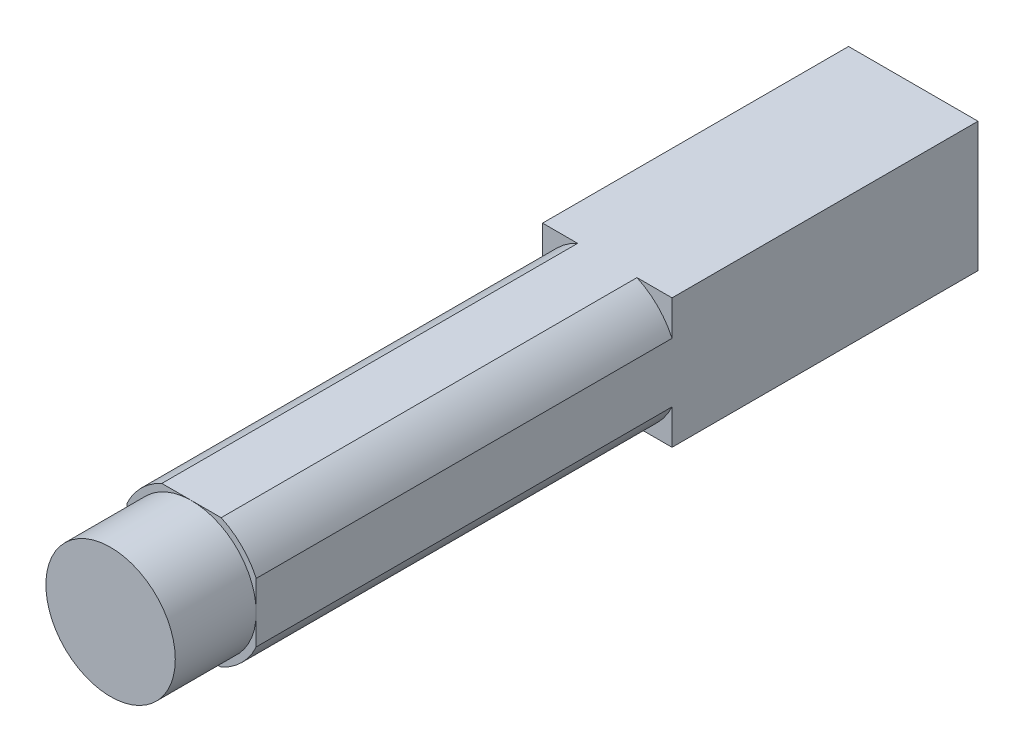
ISO-10303-21;
HEADER;
FILE_DESCRIPTION(('STEP AP214'),'2;1');
FILE_NAME('part.step','',(''),(''),'','','');
FILE_SCHEMA(('AUTOMOTIVE_DESIGN { 1 0 10303 214 1 1 1 1 }'));
ENDSEC;
DATA;
#1=APPLICATION_CONTEXT('core data for automotive mechanical design processes');
#2=APPLICATION_PROTOCOL_DEFINITION('international standard','automotive_design',2000,#1);
#3=PRODUCT_CONTEXT('',#1,'mechanical');
#4=PRODUCT('Part','Part','',(#3));
#5=PRODUCT_RELATED_PRODUCT_CATEGORY('part','',(#4));
#6=PRODUCT_DEFINITION_FORMATION('','',#4);
#7=PRODUCT_DEFINITION_CONTEXT('part definition',#1,'design');
#8=PRODUCT_DEFINITION('design','',#6,#7);
#9=PRODUCT_DEFINITION_SHAPE('','',#8);
#10=(LENGTH_UNIT() NAMED_UNIT(*) SI_UNIT(.MILLI.,.METRE.));
#11=(NAMED_UNIT(*) PLANE_ANGLE_UNIT() SI_UNIT($,.RADIAN.));
#12=(NAMED_UNIT(*) SI_UNIT($,.STERADIAN.) SOLID_ANGLE_UNIT());
#13=UNCERTAINTY_MEASURE_WITH_UNIT(LENGTH_MEASURE(1.E-05),#10,'distance_accuracy_value','');
#14=(GEOMETRIC_REPRESENTATION_CONTEXT(3) GLOBAL_UNCERTAINTY_ASSIGNED_CONTEXT((#13)) GLOBAL_UNIT_ASSIGNED_CONTEXT((#10,
#11,#12)) REPRESENTATION_CONTEXT('',''));
#15=CARTESIAN_POINT('',(0.,0.,0.));
#16=DIRECTION('',(0.,0.,1.));
#17=DIRECTION('',(1.,0.,0.));
#18=AXIS2_PLACEMENT_3D('',#15,#16,#17);
#19=CARTESIAN_POINT('',(3.175,3.175,39.37));
#20=DIRECTION('',(-1.,0.,0.));
#21=DIRECTION('',(0.,-1.,0.));
#22=AXIS2_PLACEMENT_3D('',#19,#20,#21);
#23=PLANE('',#22);
#24=DIRECTION('',(0.,1.,0.));
#25=VECTOR('',#24,1.);
#26=CARTESIAN_POINT('',(3.175,3.175,15.006574));
#27=LINE('',#26,#25);
#28=CARTESIAN_POINT('',(3.175,-3.175,15.006574));
#29=VERTEX_POINT('',#28);
#30=CARTESIAN_POINT('',(3.175,-1.45496778314848,15.006574));
#31=VERTEX_POINT('',#30);
#32=EDGE_CURVE('E153',#29,#31,#27,.T.);
#33=ORIENTED_EDGE('',*,*,#32,.F.);
#34=DIRECTION('',(0.,0.,-1.));
#35=VECTOR('',#34,1.);
#36=CARTESIAN_POINT('',(3.175,-3.175,39.37));
#37=LINE('',#36,#35);
#38=CARTESIAN_POINT('',(3.175,-3.175,0.));
#39=VERTEX_POINT('',#38);
#40=EDGE_CURVE('E223',#29,#39,#37,.T.);
#41=ORIENTED_EDGE('',*,*,#40,.T.);
#42=DIRECTION('',(0.,1.,0.));
#43=VECTOR('',#42,1.);
#44=CARTESIAN_POINT('',(3.175,3.175,0.));
#45=LINE('',#44,#43);
#46=CARTESIAN_POINT('',(3.175,3.175,0.));
#47=VERTEX_POINT('',#46);
#48=EDGE_CURVE('E212',#39,#47,#45,.T.);
#49=ORIENTED_EDGE('',*,*,#48,.T.);
#50=DIRECTION('',(0.,0.,-1.));
#51=VECTOR('',#50,1.);
#52=CARTESIAN_POINT('',(3.175,3.175,39.37));
#53=LINE('',#52,#51);
#54=CARTESIAN_POINT('',(3.175,3.175,15.006574));
#55=VERTEX_POINT('',#54);
#56=EDGE_CURVE('E147',#55,#47,#53,.T.);
#57=ORIENTED_EDGE('',*,*,#56,.F.);
#58=CARTESIAN_POINT('',(3.175,1.45496778314848,15.006574));
#59=VERTEX_POINT('',#58);
#60=EDGE_CURVE('E136',#59,#55,#27,.T.);
#61=ORIENTED_EDGE('',*,*,#60,.F.);
#62=DIRECTION('',(0.,0.,1.));
#63=VECTOR('',#62,1.);
#64=CARTESIAN_POINT('',(3.175,1.45496778314848,15.006574));
#65=LINE('',#64,#63);
#66=CARTESIAN_POINT('',(3.175,1.45496778314848,35.40125));
#67=VERTEX_POINT('',#66);
#68=EDGE_CURVE('E126',#67,#59,#65,.F.);
#69=ORIENTED_EDGE('',*,*,#68,.F.);
#70=DIRECTION('',(0.,1.,0.));
#71=VECTOR('',#70,1.);
#72=CARTESIAN_POINT('',(3.175,-3.175,35.40125));
#73=LINE('',#72,#71);
#74=CARTESIAN_POINT('',(3.175,-1.45496778314848,35.40125));
#75=VERTEX_POINT('',#74);
#76=EDGE_CURVE('E206',#75,#67,#73,.T.);
#77=ORIENTED_EDGE('',*,*,#76,.F.);
#78=DIRECTION('',(0.,0.,1.));
#79=VECTOR('',#78,1.);
#80=CARTESIAN_POINT('',(3.175,-1.45496778314848,15.006574));
#81=LINE('',#80,#79);
#82=EDGE_CURVE('E61',#31,#75,#81,.T.);
#83=ORIENTED_EDGE('',*,*,#82,.F.);
#84=EDGE_LOOP('',(#33,#41,#49,#57,#61,#69,#77,#83));
#85=FACE_BOUND('',#84,.T.);
#86=ADVANCED_FACE('F41',(#85),#23,.F.);
#87=CARTESIAN_POINT('',(-3.175,3.175,39.37));
#88=DIRECTION('',(0.,-1.,0.));
#89=DIRECTION('',(0.,0.,-1.));
#90=AXIS2_PLACEMENT_3D('',#87,#88,#89);
#91=PLANE('',#90);
#92=DIRECTION('',(-1.,0.,0.));
#93=VECTOR('',#92,1.);
#94=CARTESIAN_POINT('',(-3.175,3.175,15.006574));
#95=LINE('',#94,#93);
#96=CARTESIAN_POINT('',(1.45496778314848,3.175,15.006574));
#97=VERTEX_POINT('',#96);
#98=EDGE_CURVE('E142',#55,#97,#95,.T.);
#99=ORIENTED_EDGE('',*,*,#98,.F.);
#100=ORIENTED_EDGE('',*,*,#56,.T.);
#101=DIRECTION('',(-1.,0.,0.));
#102=VECTOR('',#101,1.);
#103=CARTESIAN_POINT('',(-3.175,3.175,0.));
#104=LINE('',#103,#102);
#105=CARTESIAN_POINT('',(-3.175,3.175,0.));
#106=VERTEX_POINT('',#105);
#107=EDGE_CURVE('E216',#47,#106,#104,.T.);
#108=ORIENTED_EDGE('',*,*,#107,.T.);
#109=DIRECTION('',(0.,0.,-1.));
#110=VECTOR('',#109,1.);
#111=CARTESIAN_POINT('',(-3.175,3.175,39.37));
#112=LINE('',#111,#110);
#113=CARTESIAN_POINT('',(-3.175,3.175,15.006574));
#114=VERTEX_POINT('',#113);
#115=EDGE_CURVE('E227',#114,#106,#112,.T.);
#116=ORIENTED_EDGE('',*,*,#115,.F.);
#117=CARTESIAN_POINT('',(-1.45496778314848,3.175,15.006574));
#118=VERTEX_POINT('',#117);
#119=EDGE_CURVE('E160',#118,#114,#95,.T.);
#120=ORIENTED_EDGE('',*,*,#119,.F.);
#121=DIRECTION('',(0.,0.,1.));
#122=VECTOR('',#121,1.);
#123=CARTESIAN_POINT('',(-1.45496778314848,3.175,15.006574));
#124=LINE('',#123,#122);
#125=CARTESIAN_POINT('',(-1.45496778314848,3.175,35.40125));
#126=VERTEX_POINT('',#125);
#127=EDGE_CURVE('E170',#126,#118,#124,.F.);
#128=ORIENTED_EDGE('',*,*,#127,.F.);
#129=DIRECTION('',(-1.,0.,0.));
#130=VECTOR('',#129,1.);
#131=CARTESIAN_POINT('',(3.175,3.175,35.40125));
#132=LINE('',#131,#130);
#133=CARTESIAN_POINT('',(1.45496778314848,3.175,35.40125));
#134=VERTEX_POINT('',#133);
#135=EDGE_CURVE('E215',#134,#126,#132,.T.);
#136=ORIENTED_EDGE('',*,*,#135,.F.);
#137=DIRECTION('',(0.,0.,1.));
#138=VECTOR('',#137,1.);
#139=CARTESIAN_POINT('',(1.45496778314848,3.175,15.006574));
#140=LINE('',#139,#138);
#141=EDGE_CURVE('E54',#97,#134,#140,.T.);
#142=ORIENTED_EDGE('',*,*,#141,.F.);
#143=EDGE_LOOP('',(#99,#100,#108,#116,#120,#128,#136,#142));
#144=FACE_BOUND('',#143,.T.);
#145=ADVANCED_FACE('F249',(#144),#91,.F.);
#146=CARTESIAN_POINT('',(-3.175,3.175,39.37));
#147=DIRECTION('',(1.,0.,0.));
#148=DIRECTION('',(0.,1.,0.));
#149=AXIS2_PLACEMENT_3D('',#146,#147,#148);
#150=PLANE('',#149);
#151=DIRECTION('',(0.,-1.,0.));
#152=VECTOR('',#151,1.);
#153=CARTESIAN_POINT('',(-3.175,3.175,15.006574));
#154=LINE('',#153,#152);
#155=CARTESIAN_POINT('',(-3.175,1.45496778314848,15.006574));
#156=VERTEX_POINT('',#155);
#157=EDGE_CURVE('E163',#114,#156,#154,.T.);
#158=ORIENTED_EDGE('',*,*,#157,.F.);
#159=ORIENTED_EDGE('',*,*,#115,.T.);
#160=DIRECTION('',(0.,-1.,0.));
#161=VECTOR('',#160,1.);
#162=CARTESIAN_POINT('',(-3.175,3.175,0.));
#163=LINE('',#162,#161);
#164=CARTESIAN_POINT('',(-3.175,-3.175,0.));
#165=VERTEX_POINT('',#164);
#166=EDGE_CURVE('E218',#106,#165,#163,.T.);
#167=ORIENTED_EDGE('',*,*,#166,.T.);
#168=DIRECTION('',(0.,0.,-1.));
#169=VECTOR('',#168,1.);
#170=CARTESIAN_POINT('',(-3.175,-3.175,39.37));
#171=LINE('',#170,#169);
#172=CARTESIAN_POINT('',(-3.175,-3.175,15.006574));
#173=VERTEX_POINT('',#172);
#174=EDGE_CURVE('E230',#173,#165,#171,.T.);
#175=ORIENTED_EDGE('',*,*,#174,.F.);
#176=CARTESIAN_POINT('',(-3.175,-1.45496778314848,15.006574));
#177=VERTEX_POINT('',#176);
#178=EDGE_CURVE('E161',#177,#173,#154,.T.);
#179=ORIENTED_EDGE('',*,*,#178,.F.);
#180=DIRECTION('',(0.,0.,1.));
#181=VECTOR('',#180,1.);
#182=CARTESIAN_POINT('',(-3.175,-1.45496778314848,15.006574));
#183=LINE('',#182,#181);
#184=CARTESIAN_POINT('',(-3.175,-1.45496778314848,35.40125));
#185=VERTEX_POINT('',#184);
#186=EDGE_CURVE('E173',#185,#177,#183,.F.);
#187=ORIENTED_EDGE('',*,*,#186,.F.);
#188=DIRECTION('',(0.,-1.,0.));
#189=VECTOR('',#188,1.);
#190=CARTESIAN_POINT('',(-3.175,-3.175,35.40125));
#191=LINE('',#190,#189);
#192=CARTESIAN_POINT('',(-3.175,1.45496778314848,35.40125));
#193=VERTEX_POINT('',#192);
#194=EDGE_CURVE('E199',#193,#185,#191,.T.);
#195=ORIENTED_EDGE('',*,*,#194,.F.);
#196=DIRECTION('',(0.,0.,1.));
#197=VECTOR('',#196,1.);
#198=CARTESIAN_POINT('',(-3.175,1.45496778314848,15.006574));
#199=LINE('',#198,#197);
#200=EDGE_CURVE('E166',#156,#193,#199,.T.);
#201=ORIENTED_EDGE('',*,*,#200,.F.);
#202=EDGE_LOOP('',(#158,#159,#167,#175,#179,#187,#195,#201));
#203=FACE_BOUND('',#202,.T.);
#204=ADVANCED_FACE('F198',(#203),#150,.F.);
#205=CARTESIAN_POINT('',(-3.175,-3.175,39.37));
#206=DIRECTION('',(0.,1.,0.));
#207=DIRECTION('',(0.,0.,1.));
#208=AXIS2_PLACEMENT_3D('',#205,#206,#207);
#209=PLANE('',#208);
#210=DIRECTION('',(1.,0.,0.));
#211=VECTOR('',#210,1.);
#212=CARTESIAN_POINT('',(-3.175,-3.175,15.006574));
#213=LINE('',#212,#211);
#214=CARTESIAN_POINT('',(-1.45496778314848,-3.175,15.006574));
#215=VERTEX_POINT('',#214);
#216=EDGE_CURVE('E11',#173,#215,#213,.T.);
#217=ORIENTED_EDGE('',*,*,#216,.F.);
#218=ORIENTED_EDGE('',*,*,#174,.T.);
#219=DIRECTION('',(1.,0.,0.));
#220=VECTOR('',#219,1.);
#221=CARTESIAN_POINT('',(-3.175,-3.175,0.));
#222=LINE('',#221,#220);
#223=EDGE_CURVE('E225',#165,#39,#222,.T.);
#224=ORIENTED_EDGE('',*,*,#223,.T.);
#225=ORIENTED_EDGE('',*,*,#40,.F.);
#226=CARTESIAN_POINT('',(1.45496778314848,-3.175,15.006574));
#227=VERTEX_POINT('',#226);
#228=EDGE_CURVE('E42',#227,#29,#213,.T.);
#229=ORIENTED_EDGE('',*,*,#228,.F.);
#230=DIRECTION('',(0.,0.,1.));
#231=VECTOR('',#230,1.);
#232=CARTESIAN_POINT('',(1.45496778314848,-3.175,15.006574));
#233=LINE('',#232,#231);
#234=CARTESIAN_POINT('',(1.45496778314848,-3.175,35.40125));
#235=VERTEX_POINT('',#234);
#236=EDGE_CURVE('E141',#235,#227,#233,.F.);
#237=ORIENTED_EDGE('',*,*,#236,.F.);
#238=DIRECTION('',(1.,0.,0.));
#239=VECTOR('',#238,1.);
#240=CARTESIAN_POINT('',(3.175,-3.175,35.40125));
#241=LINE('',#240,#239);
#242=CARTESIAN_POINT('',(-1.45496778314848,-3.175,35.40125));
#243=VERTEX_POINT('',#242);
#244=EDGE_CURVE('E201',#243,#235,#241,.T.);
#245=ORIENTED_EDGE('',*,*,#244,.F.);
#246=DIRECTION('',(0.,0.,1.));
#247=VECTOR('',#246,1.);
#248=CARTESIAN_POINT('',(-1.45496778314848,-3.175,15.006574));
#249=LINE('',#248,#247);
#250=EDGE_CURVE('E171',#215,#243,#249,.T.);
#251=ORIENTED_EDGE('',*,*,#250,.F.);
#252=EDGE_LOOP('',(#217,#218,#224,#225,#229,#237,#245,#251));
#253=FACE_BOUND('',#252,.T.);
#254=ADVANCED_FACE('F238',(#253),#209,.F.);
#255=CARTESIAN_POINT('',(0.,0.,35.40125));
#256=DIRECTION('',(0.,0.,1.));
#257=DIRECTION('',(1.,0.,0.));
#258=AXIS2_PLACEMENT_3D('',#255,#256,#257);
#259=PLANE('',#258);
#260=CARTESIAN_POINT('',(0.,0.,35.40125));
#261=DIRECTION('',(0.,0.,1.));
#262=DIRECTION('',(1.,0.,0.));
#263=AXIS2_PLACEMENT_3D('',#260,#261,#262);
#264=CIRCLE('',#263,3.17373);
#265=CARTESIAN_POINT('',(3.17373,0.,35.40125));
#266=VERTEX_POINT('',#265);
#267=EDGE_CURVE('E154',#266,#266,#264,.T.);
#268=ORIENTED_EDGE('',*,*,#267,.F.);
#269=EDGE_LOOP('',(#268));
#270=FACE_BOUND('',#269,.T.);
#271=ORIENTED_EDGE('',*,*,#76,.T.);
#272=CARTESIAN_POINT('',(0.,0.,35.40125));
#273=DIRECTION('',(0.,0.,1.));
#274=DIRECTION('',(1.,0.,0.));
#275=AXIS2_PLACEMENT_3D('',#272,#273,#274);
#276=CIRCLE('',#275,3.4925);
#277=EDGE_CURVE('E135',#67,#134,#276,.T.);
#278=ORIENTED_EDGE('',*,*,#277,.T.);
#279=ORIENTED_EDGE('',*,*,#135,.T.);
#280=CARTESIAN_POINT('',(0.,0.,35.40125));
#281=DIRECTION('',(0.,0.,1.));
#282=DIRECTION('',(1.,0.,0.));
#283=AXIS2_PLACEMENT_3D('',#280,#281,#282);
#284=CIRCLE('',#283,3.4925);
#285=EDGE_CURVE('E233',#126,#193,#284,.T.);
#286=ORIENTED_EDGE('',*,*,#285,.T.);
#287=ORIENTED_EDGE('',*,*,#194,.T.);
#288=EDGE_CURVE('E235',#185,#243,#284,.T.);
#289=ORIENTED_EDGE('',*,*,#288,.T.);
#290=ORIENTED_EDGE('',*,*,#244,.T.);
#291=EDGE_CURVE('E232',#235,#75,#284,.T.);
#292=ORIENTED_EDGE('',*,*,#291,.T.);
#293=EDGE_LOOP('',(#271,#278,#279,#286,#287,#289,#290,#292));
#294=FACE_BOUND('',#293,.T.);
#295=ADVANCED_FACE('F246',(#270,#294),#259,.T.);
#296=CARTESIAN_POINT('',(0.,0.,0.));
#297=DIRECTION('',(0.,0.,1.));
#298=DIRECTION('',(1.,0.,0.));
#299=AXIS2_PLACEMENT_3D('',#296,#297,#298);
#300=PLANE('',#299);
#301=ORIENTED_EDGE('',*,*,#48,.F.);
#302=ORIENTED_EDGE('',*,*,#223,.F.);
#303=ORIENTED_EDGE('',*,*,#166,.F.);
#304=ORIENTED_EDGE('',*,*,#107,.F.);
#305=EDGE_LOOP('',(#301,#302,#303,#304));
#306=FACE_BOUND('',#305,.T.);
#307=ADVANCED_FACE('F250',(#306),#300,.F.);
#308=CARTESIAN_POINT('',(0.,0.,35.40125));
#309=DIRECTION('',(0.,0.,1.));
#310=DIRECTION('',(1.,0.,0.));
#311=AXIS2_PLACEMENT_3D('',#308,#309,#310);
#312=CYLINDRICAL_SURFACE('',#311,3.17373);
#313=ORIENTED_EDGE('',*,*,#267,.T.);
#314=EDGE_LOOP('',(#313));
#315=FACE_BOUND('',#314,.T.);
#316=CARTESIAN_POINT('',(0.,0.,39.37));
#317=DIRECTION('',(0.,0.,1.));
#318=DIRECTION('',(1.,0.,0.));
#319=AXIS2_PLACEMENT_3D('',#316,#317,#318);
#320=CIRCLE('',#319,3.17373);
#321=CARTESIAN_POINT('',(3.17373,0.,39.37));
#322=VERTEX_POINT('',#321);
#323=EDGE_CURVE('E151',#322,#322,#320,.T.);
#324=ORIENTED_EDGE('',*,*,#323,.F.);
#325=EDGE_LOOP('',(#324));
#326=FACE_BOUND('',#325,.T.);
#327=ADVANCED_FACE('F259',(#315,#326),#312,.T.);
#328=CARTESIAN_POINT('',(0.,0.,39.37));
#329=DIRECTION('',(0.,0.,1.));
#330=DIRECTION('',(1.,0.,0.));
#331=AXIS2_PLACEMENT_3D('',#328,#329,#330);
#332=PLANE('',#331);
#333=ORIENTED_EDGE('',*,*,#323,.T.);
#334=EDGE_LOOP('',(#333));
#335=FACE_BOUND('',#334,.T.);
#336=ADVANCED_FACE('F273',(#335),#332,.T.);
#337=CARTESIAN_POINT('',(0.,0.,15.006574));
#338=DIRECTION('',(0.,0.,1.));
#339=DIRECTION('',(1.,0.,0.));
#340=AXIS2_PLACEMENT_3D('',#337,#338,#339);
#341=CYLINDRICAL_SURFACE('',#340,3.4925);
#342=ORIENTED_EDGE('',*,*,#82,.T.);
#343=ORIENTED_EDGE('',*,*,#291,.F.);
#344=ORIENTED_EDGE('',*,*,#236,.T.);
#345=CARTESIAN_POINT('',(0.,0.,15.006574));
#346=DIRECTION('',(0.,0.,1.));
#347=DIRECTION('',(1.,0.,0.));
#348=AXIS2_PLACEMENT_3D('',#345,#346,#347);
#349=CIRCLE('',#348,3.4925);
#350=EDGE_CURVE('E148',#227,#31,#349,.T.);
#351=ORIENTED_EDGE('',*,*,#350,.T.);
#352=EDGE_LOOP('',(#342,#343,#344,#351));
#353=FACE_BOUND('',#352,.T.);
#354=ADVANCED_FACE('F274',(#353),#341,.T.);
#355=CARTESIAN_POINT('',(0.,0.,15.006574));
#356=DIRECTION('',(0.,0.,1.));
#357=DIRECTION('',(1.,0.,0.));
#358=AXIS2_PLACEMENT_3D('',#355,#356,#357);
#359=PLANE('',#358);
#360=ORIENTED_EDGE('',*,*,#32,.T.);
#361=ORIENTED_EDGE('',*,*,#350,.F.);
#362=ORIENTED_EDGE('',*,*,#228,.T.);
#363=EDGE_LOOP('',(#360,#361,#362));
#364=FACE_BOUND('',#363,.T.);
#365=ADVANCED_FACE('F231',(#364),#359,.T.);
#366=ORIENTED_EDGE('',*,*,#186,.T.);
#367=EDGE_CURVE('E179',#177,#215,#349,.T.);
#368=ORIENTED_EDGE('',*,*,#367,.T.);
#369=ORIENTED_EDGE('',*,*,#250,.T.);
#370=ORIENTED_EDGE('',*,*,#288,.F.);
#371=EDGE_LOOP('',(#366,#368,#369,#370));
#372=FACE_BOUND('',#371,.T.);
#373=ADVANCED_FACE('F283',(#372),#341,.T.);
#374=ORIENTED_EDGE('',*,*,#178,.T.);
#375=ORIENTED_EDGE('',*,*,#216,.T.);
#376=ORIENTED_EDGE('',*,*,#367,.F.);
#377=EDGE_LOOP('',(#374,#375,#376));
#378=FACE_BOUND('',#377,.T.);
#379=ADVANCED_FACE('F294',(#378),#359,.T.);
#380=ORIENTED_EDGE('',*,*,#127,.T.);
#381=EDGE_CURVE('E145',#118,#156,#349,.T.);
#382=ORIENTED_EDGE('',*,*,#381,.T.);
#383=ORIENTED_EDGE('',*,*,#200,.T.);
#384=ORIENTED_EDGE('',*,*,#285,.F.);
#385=EDGE_LOOP('',(#380,#382,#383,#384));
#386=FACE_BOUND('',#385,.T.);
#387=ADVANCED_FACE('F186',(#386),#341,.T.);
#388=ORIENTED_EDGE('',*,*,#119,.T.);
#389=ORIENTED_EDGE('',*,*,#157,.T.);
#390=ORIENTED_EDGE('',*,*,#381,.F.);
#391=EDGE_LOOP('',(#388,#389,#390));
#392=FACE_BOUND('',#391,.T.);
#393=ADVANCED_FACE('F289',(#392),#359,.T.);
#394=ORIENTED_EDGE('',*,*,#60,.T.);
#395=ORIENTED_EDGE('',*,*,#98,.T.);
#396=EDGE_CURVE('E133',#59,#97,#349,.T.);
#397=ORIENTED_EDGE('',*,*,#396,.F.);
#398=EDGE_LOOP('',(#394,#395,#397));
#399=FACE_BOUND('',#398,.T.);
#400=ADVANCED_FACE('F139',(#399),#359,.T.);
#401=ORIENTED_EDGE('',*,*,#68,.T.);
#402=ORIENTED_EDGE('',*,*,#396,.T.);
#403=ORIENTED_EDGE('',*,*,#141,.T.);
#404=ORIENTED_EDGE('',*,*,#277,.F.);
#405=EDGE_LOOP('',(#401,#402,#403,#404));
#406=FACE_BOUND('',#405,.T.);
#407=ADVANCED_FACE('F128',(#406),#341,.T.);
#408=CLOSED_SHELL('',(#86,#145,#204,#254,#295,#307,#327,#336,#354,#365,#373,#379,#387,#393,#400,#407));
#409=MANIFOLD_SOLID_BREP('B2',#408);
#410=ADVANCED_BREP_SHAPE_REPRESENTATION('',(#18,#409),#14);
#411=SHAPE_DEFINITION_REPRESENTATION(#9,#410);
ENDSEC;
END-ISO-10303-21;
